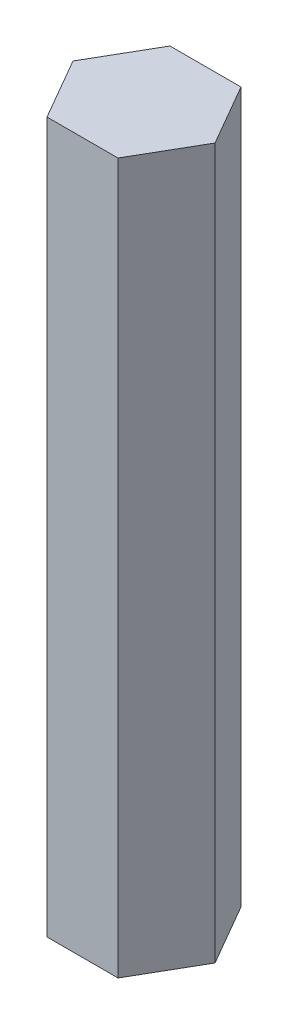
ISO-10303-21;
HEADER;
FILE_DESCRIPTION(('STEP AP214'),'2;1');
FILE_NAME('part.step','',(''),(''),'','','');
FILE_SCHEMA(('AUTOMOTIVE_DESIGN { 1 0 10303 214 1 1 1 1 }'));
ENDSEC;
DATA;
#1=APPLICATION_CONTEXT('core data for automotive mechanical design processes');
#2=APPLICATION_PROTOCOL_DEFINITION('international standard','automotive_design',2000,#1);
#3=PRODUCT_CONTEXT('',#1,'mechanical');
#4=PRODUCT('Part','Part','',(#3));
#5=PRODUCT_RELATED_PRODUCT_CATEGORY('part','',(#4));
#6=PRODUCT_DEFINITION_FORMATION('','',#4);
#7=PRODUCT_DEFINITION_CONTEXT('part definition',#1,'design');
#8=PRODUCT_DEFINITION('design','',#6,#7);
#9=PRODUCT_DEFINITION_SHAPE('','',#8);
#10=(LENGTH_UNIT() NAMED_UNIT(*) SI_UNIT(.MILLI.,.METRE.));
#11=(NAMED_UNIT(*) PLANE_ANGLE_UNIT() SI_UNIT($,.RADIAN.));
#12=(NAMED_UNIT(*) SI_UNIT($,.STERADIAN.) SOLID_ANGLE_UNIT());
#13=UNCERTAINTY_MEASURE_WITH_UNIT(LENGTH_MEASURE(1.E-05),#10,'distance_accuracy_value','');
#14=(GEOMETRIC_REPRESENTATION_CONTEXT(3) GLOBAL_UNCERTAINTY_ASSIGNED_CONTEXT((#13)) GLOBAL_UNIT_ASSIGNED_CONTEXT((#10,
#11,#12)) REPRESENTATION_CONTEXT('',''));
#15=CARTESIAN_POINT('',(0.,0.,0.));
#16=DIRECTION('',(0.,0.,1.));
#17=DIRECTION('',(1.,0.,0.));
#18=AXIS2_PLACEMENT_3D('',#15,#16,#17);
#19=CARTESIAN_POINT('',(1.5,30.,2.59807621135332));
#20=DIRECTION('',(-0.866025403784439,0.,-0.5));
#21=DIRECTION('',(-0.5,0.,0.866025403784439));
#22=AXIS2_PLACEMENT_3D('',#19,#20,#21);
#23=PLANE('',#22);
#24=DIRECTION('',(0.5,0.,-0.866025403784439));
#25=VECTOR('',#24,1.);
#26=CARTESIAN_POINT('',(1.5,0.,2.59807621135332));
#27=LINE('',#26,#25);
#28=CARTESIAN_POINT('',(1.5,0.,2.59807621135332));
#29=VERTEX_POINT('',#28);
#30=CARTESIAN_POINT('',(3.,0.,0.));
#31=VERTEX_POINT('',#30);
#32=EDGE_CURVE('E116',#29,#31,#27,.T.);
#33=ORIENTED_EDGE('',*,*,#32,.T.);
#34=DIRECTION('',(0.,-1.,0.));
#35=VECTOR('',#34,1.);
#36=CARTESIAN_POINT('',(3.,30.,0.));
#37=LINE('',#36,#35);
#38=CARTESIAN_POINT('',(3.,30.,0.));
#39=VERTEX_POINT('',#38);
#40=EDGE_CURVE('E11',#39,#31,#37,.T.);
#41=ORIENTED_EDGE('',*,*,#40,.F.);
#42=DIRECTION('',(0.5,0.,-0.866025403784439));
#43=VECTOR('',#42,1.);
#44=CARTESIAN_POINT('',(1.5,30.,2.59807621135332));
#45=LINE('',#44,#43);
#46=CARTESIAN_POINT('',(1.5,30.,2.59807621135332));
#47=VERTEX_POINT('',#46);
#48=EDGE_CURVE('E127',#47,#39,#45,.T.);
#49=ORIENTED_EDGE('',*,*,#48,.F.);
#50=DIRECTION('',(0.,-1.,0.));
#51=VECTOR('',#50,1.);
#52=CARTESIAN_POINT('',(1.5,30.,2.59807621135332));
#53=LINE('',#52,#51);
#54=EDGE_CURVE('E112',#47,#29,#53,.T.);
#55=ORIENTED_EDGE('',*,*,#54,.T.);
#56=EDGE_LOOP('',(#33,#41,#49,#55));
#57=FACE_BOUND('',#56,.T.);
#58=ADVANCED_FACE('F32',(#57),#23,.F.);
#59=CARTESIAN_POINT('',(3.,30.,0.));
#60=DIRECTION('',(-0.866025403784439,0.,0.5));
#61=DIRECTION('',(0.5,0.,0.866025403784439));
#62=AXIS2_PLACEMENT_3D('',#59,#60,#61);
#63=PLANE('',#62);
#64=DIRECTION('',(-0.5,0.,-0.866025403784439));
#65=VECTOR('',#64,1.);
#66=CARTESIAN_POINT('',(3.,0.,0.));
#67=LINE('',#66,#65);
#68=CARTESIAN_POINT('',(1.5,0.,-2.59807621135332));
#69=VERTEX_POINT('',#68);
#70=EDGE_CURVE('E119',#31,#69,#67,.T.);
#71=ORIENTED_EDGE('',*,*,#70,.T.);
#72=DIRECTION('',(0.,-1.,0.));
#73=VECTOR('',#72,1.);
#74=CARTESIAN_POINT('',(1.5,30.,-2.59807621135332));
#75=LINE('',#74,#73);
#76=CARTESIAN_POINT('',(1.5,30.,-2.59807621135332));
#77=VERTEX_POINT('',#76);
#78=EDGE_CURVE('E40',#77,#69,#75,.T.);
#79=ORIENTED_EDGE('',*,*,#78,.F.);
#80=DIRECTION('',(-0.5,0.,-0.866025403784439));
#81=VECTOR('',#80,1.);
#82=CARTESIAN_POINT('',(3.,30.,0.));
#83=LINE('',#82,#81);
#84=EDGE_CURVE('E85',#39,#77,#83,.T.);
#85=ORIENTED_EDGE('',*,*,#84,.F.);
#86=ORIENTED_EDGE('',*,*,#40,.T.);
#87=EDGE_LOOP('',(#71,#79,#85,#86));
#88=FACE_BOUND('',#87,.T.);
#89=ADVANCED_FACE('F151',(#88),#63,.F.);
#90=CARTESIAN_POINT('',(1.5,30.,-2.59807621135332));
#91=DIRECTION('',(0.,0.,1.));
#92=DIRECTION('',(1.,0.,0.));
#93=AXIS2_PLACEMENT_3D('',#90,#91,#92);
#94=PLANE('',#93);
#95=DIRECTION('',(-1.,0.,0.));
#96=VECTOR('',#95,1.);
#97=CARTESIAN_POINT('',(1.5,0.,-2.59807621135332));
#98=LINE('',#97,#96);
#99=CARTESIAN_POINT('',(-1.5,0.,-2.59807621135332));
#100=VERTEX_POINT('',#99);
#101=EDGE_CURVE('E122',#69,#100,#98,.T.);
#102=ORIENTED_EDGE('',*,*,#101,.T.);
#103=DIRECTION('',(0.,-1.,0.));
#104=VECTOR('',#103,1.);
#105=CARTESIAN_POINT('',(-1.5,30.,-2.59807621135332));
#106=LINE('',#105,#104);
#107=CARTESIAN_POINT('',(-1.5,30.,-2.59807621135332));
#108=VERTEX_POINT('',#107);
#109=EDGE_CURVE('E107',#108,#100,#106,.T.);
#110=ORIENTED_EDGE('',*,*,#109,.F.);
#111=DIRECTION('',(-1.,0.,0.));
#112=VECTOR('',#111,1.);
#113=CARTESIAN_POINT('',(1.5,30.,-2.59807621135332));
#114=LINE('',#113,#112);
#115=EDGE_CURVE('E98',#77,#108,#114,.T.);
#116=ORIENTED_EDGE('',*,*,#115,.F.);
#117=ORIENTED_EDGE('',*,*,#78,.T.);
#118=EDGE_LOOP('',(#102,#110,#116,#117));
#119=FACE_BOUND('',#118,.T.);
#120=ADVANCED_FACE('F133',(#119),#94,.F.);
#121=CARTESIAN_POINT('',(-1.5,30.,-2.59807621135332));
#122=DIRECTION('',(0.866025403784439,0.,0.5));
#123=DIRECTION('',(0.5,0.,-0.866025403784439));
#124=AXIS2_PLACEMENT_3D('',#121,#122,#123);
#125=PLANE('',#124);
#126=DIRECTION('',(-0.5,0.,0.866025403784439));
#127=VECTOR('',#126,1.);
#128=CARTESIAN_POINT('',(-1.5,0.,-2.59807621135332));
#129=LINE('',#128,#127);
#130=CARTESIAN_POINT('',(-3.,0.,0.));
#131=VERTEX_POINT('',#130);
#132=EDGE_CURVE('E106',#100,#131,#129,.T.);
#133=ORIENTED_EDGE('',*,*,#132,.T.);
#134=DIRECTION('',(0.,-1.,0.));
#135=VECTOR('',#134,1.);
#136=CARTESIAN_POINT('',(-3.,30.,0.));
#137=LINE('',#136,#135);
#138=CARTESIAN_POINT('',(-3.,30.,0.));
#139=VERTEX_POINT('',#138);
#140=EDGE_CURVE('E103',#139,#131,#137,.T.);
#141=ORIENTED_EDGE('',*,*,#140,.F.);
#142=DIRECTION('',(-0.5,0.,0.866025403784439));
#143=VECTOR('',#142,1.);
#144=CARTESIAN_POINT('',(-1.5,30.,-2.59807621135332));
#145=LINE('',#144,#143);
#146=EDGE_CURVE('E92',#108,#139,#145,.T.);
#147=ORIENTED_EDGE('',*,*,#146,.F.);
#148=ORIENTED_EDGE('',*,*,#109,.T.);
#149=EDGE_LOOP('',(#133,#141,#147,#148));
#150=FACE_BOUND('',#149,.T.);
#151=ADVANCED_FACE('F104',(#150),#125,.F.);
#152=CARTESIAN_POINT('',(-3.,30.,0.));
#153=DIRECTION('',(0.866025403784439,0.,-0.5));
#154=DIRECTION('',(-0.5,0.,-0.866025403784439));
#155=AXIS2_PLACEMENT_3D('',#152,#153,#154);
#156=PLANE('',#155);
#157=DIRECTION('',(0.5,0.,0.866025403784439));
#158=VECTOR('',#157,1.);
#159=CARTESIAN_POINT('',(-3.,0.,0.));
#160=LINE('',#159,#158);
#161=CARTESIAN_POINT('',(-1.5,0.,2.59807621135332));
#162=VERTEX_POINT('',#161);
#163=EDGE_CURVE('E71',#131,#162,#160,.T.);
#164=ORIENTED_EDGE('',*,*,#163,.T.);
#165=DIRECTION('',(0.,-1.,0.));
#166=VECTOR('',#165,1.);
#167=CARTESIAN_POINT('',(-1.5,30.,2.59807621135332));
#168=LINE('',#167,#166);
#169=CARTESIAN_POINT('',(-1.5,30.,2.59807621135332));
#170=VERTEX_POINT('',#169);
#171=EDGE_CURVE('E108',#170,#162,#168,.T.);
#172=ORIENTED_EDGE('',*,*,#171,.F.);
#173=DIRECTION('',(0.5,0.,0.866025403784439));
#174=VECTOR('',#173,1.);
#175=CARTESIAN_POINT('',(-3.,30.,0.));
#176=LINE('',#175,#174);
#177=EDGE_CURVE('E96',#139,#170,#176,.T.);
#178=ORIENTED_EDGE('',*,*,#177,.F.);
#179=ORIENTED_EDGE('',*,*,#140,.T.);
#180=EDGE_LOOP('',(#164,#172,#178,#179));
#181=FACE_BOUND('',#180,.T.);
#182=ADVANCED_FACE('F110',(#181),#156,.F.);
#183=CARTESIAN_POINT('',(-1.5,30.,2.59807621135332));
#184=DIRECTION('',(0.,0.,-1.));
#185=DIRECTION('',(-1.,0.,0.));
#186=AXIS2_PLACEMENT_3D('',#183,#184,#185);
#187=PLANE('',#186);
#188=DIRECTION('',(1.,0.,0.));
#189=VECTOR('',#188,1.);
#190=CARTESIAN_POINT('',(-1.5,0.,2.59807621135332));
#191=LINE('',#190,#189);
#192=EDGE_CURVE('E77',#162,#29,#191,.T.);
#193=ORIENTED_EDGE('',*,*,#192,.T.);
#194=ORIENTED_EDGE('',*,*,#54,.F.);
#195=DIRECTION('',(1.,0.,0.));
#196=VECTOR('',#195,1.);
#197=CARTESIAN_POINT('',(-1.5,30.,2.59807621135332));
#198=LINE('',#197,#196);
#199=EDGE_CURVE('E48',#170,#47,#198,.T.);
#200=ORIENTED_EDGE('',*,*,#199,.F.);
#201=ORIENTED_EDGE('',*,*,#171,.T.);
#202=EDGE_LOOP('',(#193,#194,#200,#201));
#203=FACE_BOUND('',#202,.T.);
#204=ADVANCED_FACE('F140',(#203),#187,.F.);
#205=CARTESIAN_POINT('',(0.,30.,0.));
#206=DIRECTION('',(0.,1.,0.));
#207=DIRECTION('',(0.,0.,1.));
#208=AXIS2_PLACEMENT_3D('',#205,#206,#207);
#209=PLANE('',#208);
#210=ORIENTED_EDGE('',*,*,#48,.T.);
#211=ORIENTED_EDGE('',*,*,#84,.T.);
#212=ORIENTED_EDGE('',*,*,#115,.T.);
#213=ORIENTED_EDGE('',*,*,#146,.T.);
#214=ORIENTED_EDGE('',*,*,#177,.T.);
#215=ORIENTED_EDGE('',*,*,#199,.T.);
#216=EDGE_LOOP('',(#210,#211,#212,#213,#214,#215));
#217=FACE_BOUND('',#216,.T.);
#218=ADVANCED_FACE('F94',(#217),#209,.T.);
#219=CARTESIAN_POINT('',(0.,0.,0.));
#220=DIRECTION('',(0.,1.,0.));
#221=DIRECTION('',(0.,0.,1.));
#222=AXIS2_PLACEMENT_3D('',#219,#220,#221);
#223=PLANE('',#222);
#224=CARTESIAN_POINT('',(0.,0.,0.));
#225=DIRECTION('',(0.,-1.,0.));
#226=DIRECTION('',(0.,0.,-1.));
#227=AXIS2_PLACEMENT_3D('',#224,#225,#226);
#228=CIRCLE('',#227,1.6);
#229=CARTESIAN_POINT('',(0.,0.,-1.6));
#230=VERTEX_POINT('',#229);
#231=EDGE_CURVE('E213',#230,#230,#228,.T.);
#232=ORIENTED_EDGE('',*,*,#231,.F.);
#233=EDGE_LOOP('',(#232));
#234=FACE_BOUND('',#233,.T.);
#235=ORIENTED_EDGE('',*,*,#32,.F.);
#236=ORIENTED_EDGE('',*,*,#192,.F.);
#237=ORIENTED_EDGE('',*,*,#163,.F.);
#238=ORIENTED_EDGE('',*,*,#132,.F.);
#239=ORIENTED_EDGE('',*,*,#101,.F.);
#240=ORIENTED_EDGE('',*,*,#70,.F.);
#241=EDGE_LOOP('',(#235,#236,#237,#238,#239,#240));
#242=FACE_BOUND('',#241,.T.);
#243=ADVANCED_FACE('F136',(#234,#242),#223,.F.);
#244=CARTESIAN_POINT('',(0.,5.,0.));
#245=DIRECTION('',(0.,-1.,0.));
#246=DIRECTION('',(0.,0.,-1.));
#247=AXIS2_PLACEMENT_3D('',#244,#245,#246);
#248=CYLINDRICAL_SURFACE('',#247,1.6);
#249=CARTESIAN_POINT('',(0.,5.,0.));
#250=DIRECTION('',(0.,-1.,0.));
#251=DIRECTION('',(0.,0.,-1.));
#252=AXIS2_PLACEMENT_3D('',#249,#250,#251);
#253=CIRCLE('',#252,1.6);
#254=CARTESIAN_POINT('',(0.,5.,-1.6));
#255=VERTEX_POINT('',#254);
#256=EDGE_CURVE('E120',#255,#255,#253,.T.);
#257=ORIENTED_EDGE('',*,*,#256,.F.);
#258=EDGE_LOOP('',(#257));
#259=FACE_BOUND('',#258,.T.);
#260=ORIENTED_EDGE('',*,*,#231,.T.);
#261=EDGE_LOOP('',(#260));
#262=FACE_BOUND('',#261,.T.);
#263=ADVANCED_FACE('F188',(#259,#262),#248,.F.);
#264=CARTESIAN_POINT('',(0.,5.,0.));
#265=DIRECTION('',(0.,-1.,0.));
#266=DIRECTION('',(0.,0.,-1.));
#267=AXIS2_PLACEMENT_3D('',#264,#265,#266);
#268=PLANE('',#267);
#269=ORIENTED_EDGE('',*,*,#256,.T.);
#270=EDGE_LOOP('',(#269));
#271=FACE_BOUND('',#270,.T.);
#272=ADVANCED_FACE('F197',(#271),#268,.T.);
#273=CLOSED_SHELL('',(#58,#89,#120,#151,#182,#204,#218,#243,#263,#272));
#274=MANIFOLD_SOLID_BREP('B2',#273);
#275=ADVANCED_BREP_SHAPE_REPRESENTATION('',(#18,#274),#14);
#276=SHAPE_DEFINITION_REPRESENTATION(#9,#275);
ENDSEC;
END-ISO-10303-21;
